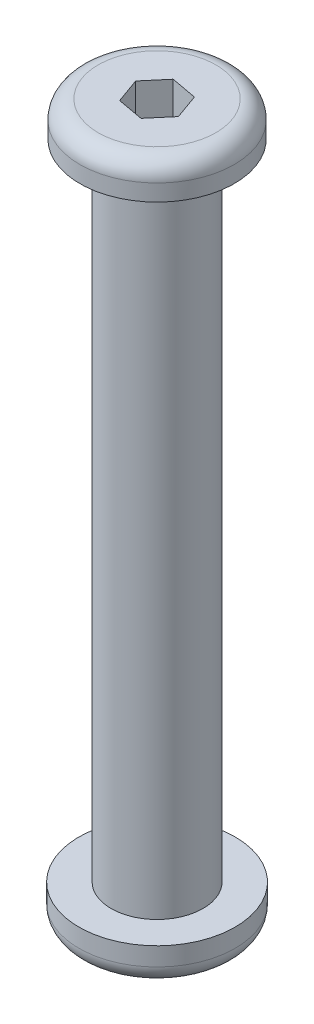
ISO-10303-21;
HEADER;
FILE_DESCRIPTION(('STEP AP214'),'2;1');
FILE_NAME('part.step','',(''),(''),'','','');
FILE_SCHEMA(('AUTOMOTIVE_DESIGN { 1 0 10303 214 1 1 1 1 }'));
ENDSEC;
DATA;
#1=APPLICATION_CONTEXT('core data for automotive mechanical design processes');
#2=APPLICATION_PROTOCOL_DEFINITION('international standard','automotive_design',2000,#1);
#3=PRODUCT_CONTEXT('',#1,'mechanical');
#4=PRODUCT('Part','Part','',(#3));
#5=PRODUCT_RELATED_PRODUCT_CATEGORY('part','',(#4));
#6=PRODUCT_DEFINITION_FORMATION('','',#4);
#7=PRODUCT_DEFINITION_CONTEXT('part definition',#1,'design');
#8=PRODUCT_DEFINITION('design','',#6,#7);
#9=PRODUCT_DEFINITION_SHAPE('','',#8);
#10=(LENGTH_UNIT() NAMED_UNIT(*) SI_UNIT(.MILLI.,.METRE.));
#11=(NAMED_UNIT(*) PLANE_ANGLE_UNIT() SI_UNIT($,.RADIAN.));
#12=(NAMED_UNIT(*) SI_UNIT($,.STERADIAN.) SOLID_ANGLE_UNIT());
#13=UNCERTAINTY_MEASURE_WITH_UNIT(LENGTH_MEASURE(1.E-05),#10,'distance_accuracy_value','');
#14=(GEOMETRIC_REPRESENTATION_CONTEXT(3) GLOBAL_UNCERTAINTY_ASSIGNED_CONTEXT((#13)) GLOBAL_UNIT_ASSIGNED_CONTEXT((#10,
#11,#12)) REPRESENTATION_CONTEXT('',''));
#15=CARTESIAN_POINT('',(0.,0.,0.));
#16=DIRECTION('',(0.,0.,1.));
#17=DIRECTION('',(1.,0.,0.));
#18=AXIS2_PLACEMENT_3D('',#15,#16,#17);
#19=CARTESIAN_POINT('',(0.,35.,0.));
#20=DIRECTION('',(0.,-1.,0.));
#21=DIRECTION('',(0.,0.,-1.));
#22=AXIS2_PLACEMENT_3D('',#19,#20,#21);
#23=CYLINDRICAL_SURFACE('',#22,2.5);
#24=CARTESIAN_POINT('',(0.,35.,0.));
#25=DIRECTION('',(0.,1.,0.));
#26=DIRECTION('',(0.,0.,1.));
#27=AXIS2_PLACEMENT_3D('',#24,#25,#26);
#28=CIRCLE('',#27,2.5);
#29=CARTESIAN_POINT('',(0.,35.,2.5));
#30=VERTEX_POINT('',#29);
#31=EDGE_CURVE('E278',#30,#30,#28,.T.);
#32=ORIENTED_EDGE('',*,*,#31,.F.);
#33=EDGE_LOOP('',(#32));
#34=FACE_BOUND('',#33,.T.);
#35=CARTESIAN_POINT('',(0.,0.,0.));
#36=DIRECTION('',(0.,-1.,0.));
#37=DIRECTION('',(0.,0.,-1.));
#38=AXIS2_PLACEMENT_3D('',#35,#36,#37);
#39=CIRCLE('',#38,2.5);
#40=CARTESIAN_POINT('',(0.,0.,-2.5));
#41=VERTEX_POINT('',#40);
#42=EDGE_CURVE('E210',#41,#41,#39,.T.);
#43=ORIENTED_EDGE('',*,*,#42,.F.);
#44=EDGE_LOOP('',(#43));
#45=FACE_BOUND('',#44,.T.);
#46=ADVANCED_FACE('F43',(#34,#45),#23,.T.);
#47=CARTESIAN_POINT('',(0.,36.9,0.));
#48=DIRECTION('',(0.,1.,0.));
#49=DIRECTION('',(0.,0.,1.));
#50=AXIS2_PLACEMENT_3D('',#47,#48,#49);
#51=PLANE('',#50);
#52=CARTESIAN_POINT('',(0.,36.9,0.));
#53=DIRECTION('',(0.,1.,0.));
#54=DIRECTION('',(0.,0.,1.));
#55=AXIS2_PLACEMENT_3D('',#52,#53,#54);
#56=CIRCLE('',#55,3.2);
#57=CARTESIAN_POINT('',(0.,36.9,3.2));
#58=VERTEX_POINT('',#57);
#59=EDGE_CURVE('E282',#58,#58,#56,.T.);
#60=ORIENTED_EDGE('',*,*,#59,.T.);
#61=EDGE_LOOP('',(#60));
#62=FACE_BOUND('',#61,.T.);
#63=DIRECTION('',(-0.983890145469255,0.,-0.178774107880554));
#64=VECTOR('',#63,1.);
#65=CARTESIAN_POINT('',(0.933529185275309,36.9,-1.10084358270035));
#66=LINE('',#65,#64);
#67=CARTESIAN_POINT('',(0.933529185275309,36.9,-1.10084358270035));
#68=VERTEX_POINT('',#67);
#69=CARTESIAN_POINT('',(-0.486593915573927,36.9,-1.35888178097279));
#70=VERTEX_POINT('',#69);
#71=EDGE_CURVE('E217',#68,#70,#66,.T.);
#72=ORIENTED_EDGE('',*,*,#71,.F.);
#73=DIRECTION('',(-0.337122153771169,0.,-0.941460914449818));
#74=VECTOR('',#73,1.);
#75=CARTESIAN_POINT('',(1.42012310084924,36.9,0.258038198272432));
#76=LINE('',#75,#74);
#77=CARTESIAN_POINT('',(1.42012310084924,36.9,0.258038198272432));
#78=VERTEX_POINT('',#77);
#79=EDGE_CURVE('E214',#78,#68,#76,.T.);
#80=ORIENTED_EDGE('',*,*,#79,.F.);
#81=DIRECTION('',(0.646767991698087,0.,-0.762686806569265));
#82=VECTOR('',#81,1.);
#83=CARTESIAN_POINT('',(0.486593915573928,36.9,1.35888178097278));
#84=LINE('',#83,#82);
#85=CARTESIAN_POINT('',(0.486593915573928,36.9,1.35888178097278));
#86=VERTEX_POINT('',#85);
#87=EDGE_CURVE('E231',#86,#78,#84,.T.);
#88=ORIENTED_EDGE('',*,*,#87,.F.);
#89=DIRECTION('',(0.983890145469255,0.,0.178774107880553));
#90=VECTOR('',#89,1.);
#91=CARTESIAN_POINT('',(-0.933529185275311,36.9,1.10084358270035));
#92=LINE('',#91,#90);
#93=CARTESIAN_POINT('',(-0.933529185275311,36.9,1.10084358270035));
#94=VERTEX_POINT('',#93);
#95=EDGE_CURVE('E227',#94,#86,#92,.T.);
#96=ORIENTED_EDGE('',*,*,#95,.F.);
#97=DIRECTION('',(0.337122153771169,0.,0.941460914449818));
#98=VECTOR('',#97,1.);
#99=CARTESIAN_POINT('',(-1.42012310084924,36.9,-0.258038198272431));
#100=LINE('',#99,#98);
#101=CARTESIAN_POINT('',(-1.42012310084924,36.9,-0.258038198272431));
#102=VERTEX_POINT('',#101);
#103=EDGE_CURVE('E224',#102,#94,#100,.T.);
#104=ORIENTED_EDGE('',*,*,#103,.F.);
#105=DIRECTION('',(-0.646767991698087,0.,0.762686806569266));
#106=VECTOR('',#105,1.);
#107=CARTESIAN_POINT('',(-0.486593915573927,36.9,-1.35888178097279));
#108=LINE('',#107,#106);
#109=EDGE_CURVE('E221',#70,#102,#108,.T.);
#110=ORIENTED_EDGE('',*,*,#109,.F.);
#111=EDGE_LOOP('',(#72,#80,#88,#96,#104,#110));
#112=FACE_BOUND('',#111,.T.);
#113=ADVANCED_FACE('F304',(#62,#112),#51,.T.);
#114=CARTESIAN_POINT('',(0.,35.,0.));
#115=DIRECTION('',(0.,1.,0.));
#116=DIRECTION('',(0.,0.,1.));
#117=AXIS2_PLACEMENT_3D('',#114,#115,#116);
#118=PLANE('',#117);
#119=ORIENTED_EDGE('',*,*,#31,.T.);
#120=EDGE_LOOP('',(#119));
#121=FACE_BOUND('',#120,.T.);
#122=CARTESIAN_POINT('',(0.,35.,0.));
#123=DIRECTION('',(0.,1.,0.));
#124=DIRECTION('',(0.,0.,1.));
#125=AXIS2_PLACEMENT_3D('',#122,#123,#124);
#126=CIRCLE('',#125,4.2);
#127=CARTESIAN_POINT('',(0.,35.,-4.2));
#128=VERTEX_POINT('',#127);
#129=EDGE_CURVE('E274',#128,#128,#126,.T.);
#130=ORIENTED_EDGE('',*,*,#129,.F.);
#131=EDGE_LOOP('',(#130));
#132=FACE_BOUND('',#131,.T.);
#133=ADVANCED_FACE('F310',(#121,#132),#118,.F.);
#134=CARTESIAN_POINT('',(0.,36.9,0.));
#135=DIRECTION('',(0.,-1.,0.));
#136=DIRECTION('',(0.,0.,-1.));
#137=AXIS2_PLACEMENT_3D('',#134,#135,#136);
#138=CYLINDRICAL_SURFACE('',#137,4.2);
#139=CARTESIAN_POINT('',(0.,35.9,0.));
#140=DIRECTION('',(0.,1.,0.));
#141=DIRECTION('',(0.,0.,1.));
#142=AXIS2_PLACEMENT_3D('',#139,#140,#141);
#143=CIRCLE('',#142,4.2);
#144=CARTESIAN_POINT('',(0.,35.9,-4.2));
#145=VERTEX_POINT('',#144);
#146=EDGE_CURVE('E286',#145,#145,#143,.F.);
#147=CARTESIAN_POINT('',(0.,35.9,-4.2));
#148=CARTESIAN_POINT('',(0.,35.890625,-4.2));
#149=CARTESIAN_POINT('',(0.,35.88125,-4.2));
#150=CARTESIAN_POINT('',(0.,35.8625,-4.2));
#151=CARTESIAN_POINT('',(0.,35.853125,-4.2));
#152=CARTESIAN_POINT('',(0.,35.834375,-4.2));
#153=CARTESIAN_POINT('',(0.,35.825,-4.2));
#154=CARTESIAN_POINT('',(0.,35.80625,-4.2));
#155=CARTESIAN_POINT('',(0.,35.796875,-4.2));
#156=CARTESIAN_POINT('',(0.,35.778125,-4.2));
#157=CARTESIAN_POINT('',(0.,35.76875,-4.2));
#158=CARTESIAN_POINT('',(0.,35.75,-4.2));
#159=CARTESIAN_POINT('',(0.,35.740625,-4.2));
#160=CARTESIAN_POINT('',(0.,35.721875,-4.2));
#161=CARTESIAN_POINT('',(0.,35.7125,-4.2));
#162=CARTESIAN_POINT('',(0.,35.69375,-4.2));
#163=CARTESIAN_POINT('',(0.,35.684375,-4.2));
#164=CARTESIAN_POINT('',(0.,35.665625,-4.2));
#165=CARTESIAN_POINT('',(0.,35.65625,-4.2));
#166=CARTESIAN_POINT('',(0.,35.6375,-4.2));
#167=CARTESIAN_POINT('',(0.,35.628125,-4.2));
#168=CARTESIAN_POINT('',(0.,35.609375,-4.2));
#169=CARTESIAN_POINT('',(0.,35.6,-4.2));
#170=CARTESIAN_POINT('',(0.,35.58125,-4.2));
#171=CARTESIAN_POINT('',(0.,35.571875,-4.2));
#172=CARTESIAN_POINT('',(0.,35.553125,-4.2));
#173=CARTESIAN_POINT('',(0.,35.54375,-4.2));
#174=CARTESIAN_POINT('',(0.,35.525,-4.2));
#175=CARTESIAN_POINT('',(0.,35.515625,-4.2));
#176=CARTESIAN_POINT('',(0.,35.496875,-4.2));
#177=CARTESIAN_POINT('',(0.,35.4875,-4.2));
#178=CARTESIAN_POINT('',(0.,35.46875,-4.2));
#179=CARTESIAN_POINT('',(0.,35.459375,-4.2));
#180=CARTESIAN_POINT('',(0.,35.440625,-4.2));
#181=CARTESIAN_POINT('',(0.,35.43125,-4.2));
#182=CARTESIAN_POINT('',(0.,35.4125,-4.2));
#183=CARTESIAN_POINT('',(0.,35.403125,-4.2));
#184=CARTESIAN_POINT('',(0.,35.384375,-4.2));
#185=CARTESIAN_POINT('',(0.,35.375,-4.2));
#186=CARTESIAN_POINT('',(0.,35.35625,-4.2));
#187=CARTESIAN_POINT('',(0.,35.346875,-4.2));
#188=CARTESIAN_POINT('',(0.,35.328125,-4.2));
#189=CARTESIAN_POINT('',(0.,35.31875,-4.2));
#190=CARTESIAN_POINT('',(0.,35.3,-4.2));
#191=CARTESIAN_POINT('',(0.,35.290625,-4.2));
#192=CARTESIAN_POINT('',(0.,35.271875,-4.2));
#193=CARTESIAN_POINT('',(0.,35.2625,-4.2));
#194=CARTESIAN_POINT('',(0.,35.24375,-4.2));
#195=CARTESIAN_POINT('',(0.,35.234375,-4.2));
#196=CARTESIAN_POINT('',(0.,35.215625,-4.2));
#197=CARTESIAN_POINT('',(0.,35.20625,-4.2));
#198=CARTESIAN_POINT('',(0.,35.1875,-4.2));
#199=CARTESIAN_POINT('',(0.,35.178125,-4.2));
#200=CARTESIAN_POINT('',(0.,35.159375,-4.2));
#201=CARTESIAN_POINT('',(0.,35.15,-4.2));
#202=CARTESIAN_POINT('',(0.,35.13125,-4.2));
#203=CARTESIAN_POINT('',(0.,35.121875,-4.2));
#204=CARTESIAN_POINT('',(0.,35.103125,-4.2));
#205=CARTESIAN_POINT('',(0.,35.09375,-4.2));
#206=CARTESIAN_POINT('',(0.,35.075,-4.2));
#207=CARTESIAN_POINT('',(0.,35.065625,-4.2));
#208=CARTESIAN_POINT('',(0.,35.046875,-4.2));
#209=CARTESIAN_POINT('',(0.,35.0375,-4.2));
#210=CARTESIAN_POINT('',(0.,35.01875,-4.2));
#211=CARTESIAN_POINT('',(0.,35.009375,-4.2));
#212=CARTESIAN_POINT('',(0.,35.,-4.2));
#213=B_SPLINE_CURVE_WITH_KNOTS('',3,(#147,#148,#149,#150,#151,#152,#153,#154,#155,#156,#157,
#158,#159,#160,#161,#162,#163,#164,#165,#166,#167,#168,#169,#170,#171,#172,#173,#174,#175,#176,
#177,#178,#179,#180,#181,#182,#183,#184,#185,#186,#187,#188,#189,#190,#191,#192,#193,#194,#195,
#196,#197,#198,#199,#200,#201,#202,#203,#204,#205,#206,#207,#208,#209,#210,#211,#212),
.UNSPECIFIED.,.F.,.F.,(4,2,2,2,2,2,2,2,2,2,2,2,2,2,2,2,2,2,2,2,2,2,2,2,2,2,2,2,2,2,2,2,4),(0.,
0.0281249999999969,0.0562499999999938,0.0843749999999976,0.112499999999995,0.140624999999998,
0.168749999999995,0.196874999999999,0.224999999999996,0.253124999999993,0.281249999999997,
0.309374999999994,0.337499999999998,0.365624999999994,0.393749999999998,0.421874999999995,
0.449999999999999,0.478124999999996,0.506249999999993,0.534374999999997,0.562499999999994,
0.590624999999997,0.618749999999994,0.646874999999998,0.674999999999995,0.703124999999992,
0.731249999999996,0.759374999999993,0.787499999999997,0.815624999999993,0.843749999999997,
0.871874999999994,0.899999999999998),.UNSPECIFIED.);
#214=EDGE_CURVE('BSEAM324',#145,#128,#213,.T.);
#215=ORIENTED_EDGE('',*,*,#146,.T.);
#216=ORIENTED_EDGE('',*,*,#129,.T.);
#217=ORIENTED_EDGE('',*,*,#214,.T.);
#218=ORIENTED_EDGE('',*,*,#214,.F.);
#219=EDGE_LOOP('',(#215,#217,#216,#218));
#220=FACE_BOUND('',#219,.T.);
#221=ADVANCED_FACE('F324',(#220),#138,.T.);
#222=CARTESIAN_POINT('',(1.42012310084924,36.9,0.258038198272432));
#223=DIRECTION('',(-0.941460914449818,0.,0.337122153771169));
#224=DIRECTION('',(0.337122153771169,0.,0.941460914449819));
#225=AXIS2_PLACEMENT_3D('',#222,#223,#224);
#226=PLANE('',#225);
#227=DIRECTION('',(-0.337122153771169,0.,-0.941460914449818));
#228=VECTOR('',#227,1.);
#229=CARTESIAN_POINT('',(1.42012310084924,35.,0.258038198272432));
#230=LINE('',#229,#228);
#231=CARTESIAN_POINT('',(1.42012310084924,35.,0.258038198272432));
#232=VERTEX_POINT('',#231);
#233=CARTESIAN_POINT('',(0.933529185275309,35.,-1.10084358270035));
#234=VERTEX_POINT('',#233);
#235=EDGE_CURVE('E67',#232,#234,#230,.T.);
#236=ORIENTED_EDGE('',*,*,#235,.F.);
#237=DIRECTION('',(0.,-1.,0.));
#238=VECTOR('',#237,1.);
#239=CARTESIAN_POINT('',(1.42012310084924,36.9,0.258038198272432));
#240=LINE('',#239,#238);
#241=EDGE_CURVE('E234',#78,#232,#240,.T.);
#242=ORIENTED_EDGE('',*,*,#241,.F.);
#243=ORIENTED_EDGE('',*,*,#79,.T.);
#244=DIRECTION('',(0.,-1.,0.));
#245=VECTOR('',#244,1.);
#246=CARTESIAN_POINT('',(0.933529185275309,36.9,-1.10084358270035));
#247=LINE('',#246,#245);
#248=EDGE_CURVE('E270',#68,#234,#247,.T.);
#249=ORIENTED_EDGE('',*,*,#248,.T.);
#250=EDGE_LOOP('',(#236,#242,#243,#249));
#251=FACE_BOUND('',#250,.T.);
#252=ADVANCED_FACE('F327',(#251),#226,.T.);
#253=CARTESIAN_POINT('',(0.933529185275309,36.9,-1.10084358270035));
#254=DIRECTION('',(-0.178774107880554,0.,0.983890145469255));
#255=DIRECTION('',(0.983890145469255,0.,0.178774107880554));
#256=AXIS2_PLACEMENT_3D('',#253,#254,#255);
#257=PLANE('',#256);
#258=DIRECTION('',(-0.983890145469255,0.,-0.178774107880554));
#259=VECTOR('',#258,1.);
#260=CARTESIAN_POINT('',(0.933529185275309,35.,-1.10084358270035));
#261=LINE('',#260,#259);
#262=CARTESIAN_POINT('',(-0.486593915573927,35.,-1.35888178097279));
#263=VERTEX_POINT('',#262);
#264=EDGE_CURVE('E237',#234,#263,#261,.T.);
#265=ORIENTED_EDGE('',*,*,#264,.F.);
#266=ORIENTED_EDGE('',*,*,#248,.F.);
#267=ORIENTED_EDGE('',*,*,#71,.T.);
#268=DIRECTION('',(0.,-1.,0.));
#269=VECTOR('',#268,1.);
#270=CARTESIAN_POINT('',(-0.486593915573927,36.9,-1.35888178097279));
#271=LINE('',#270,#269);
#272=EDGE_CURVE('E266',#70,#263,#271,.T.);
#273=ORIENTED_EDGE('',*,*,#272,.T.);
#274=EDGE_LOOP('',(#265,#266,#267,#273));
#275=FACE_BOUND('',#274,.T.);
#276=ADVANCED_FACE('F334',(#275),#257,.T.);
#277=CARTESIAN_POINT('',(-0.486593915573927,36.9,-1.35888178097279));
#278=DIRECTION('',(0.762686806569265,0.,0.646767991698086));
#279=DIRECTION('',(0.646767991698086,0.,-0.762686806569266));
#280=AXIS2_PLACEMENT_3D('',#277,#278,#279);
#281=PLANE('',#280);
#282=DIRECTION('',(-0.646767991698087,0.,0.762686806569266));
#283=VECTOR('',#282,1.);
#284=CARTESIAN_POINT('',(-0.486593915573927,35.,-1.35888178097279));
#285=LINE('',#284,#283);
#286=CARTESIAN_POINT('',(-1.42012310084924,35.,-0.258038198272431));
#287=VERTEX_POINT('',#286);
#288=EDGE_CURVE('E240',#263,#287,#285,.T.);
#289=ORIENTED_EDGE('',*,*,#288,.F.);
#290=ORIENTED_EDGE('',*,*,#272,.F.);
#291=ORIENTED_EDGE('',*,*,#109,.T.);
#292=DIRECTION('',(0.,-1.,0.));
#293=VECTOR('',#292,1.);
#294=CARTESIAN_POINT('',(-1.42012310084924,36.9,-0.258038198272431));
#295=LINE('',#294,#293);
#296=EDGE_CURVE('E262',#102,#287,#295,.T.);
#297=ORIENTED_EDGE('',*,*,#296,.T.);
#298=EDGE_LOOP('',(#289,#290,#291,#297));
#299=FACE_BOUND('',#298,.T.);
#300=ADVANCED_FACE('F338',(#299),#281,.T.);
#301=CARTESIAN_POINT('',(-1.42012310084924,36.9,-0.258038198272431));
#302=DIRECTION('',(0.941460914449818,0.,-0.337122153771169));
#303=DIRECTION('',(-0.337122153771169,0.,-0.941460914449818));
#304=AXIS2_PLACEMENT_3D('',#301,#302,#303);
#305=PLANE('',#304);
#306=DIRECTION('',(0.337122153771169,0.,0.941460914449818));
#307=VECTOR('',#306,1.);
#308=CARTESIAN_POINT('',(-1.42012310084924,35.,-0.258038198272431));
#309=LINE('',#308,#307);
#310=CARTESIAN_POINT('',(-0.933529185275311,35.,1.10084358270035));
#311=VERTEX_POINT('',#310);
#312=EDGE_CURVE('E243',#287,#311,#309,.T.);
#313=ORIENTED_EDGE('',*,*,#312,.F.);
#314=ORIENTED_EDGE('',*,*,#296,.F.);
#315=ORIENTED_EDGE('',*,*,#103,.T.);
#316=DIRECTION('',(0.,-1.,0.));
#317=VECTOR('',#316,1.);
#318=CARTESIAN_POINT('',(-0.933529185275311,36.9,1.10084358270035));
#319=LINE('',#318,#317);
#320=EDGE_CURVE('E258',#94,#311,#319,.T.);
#321=ORIENTED_EDGE('',*,*,#320,.T.);
#322=EDGE_LOOP('',(#313,#314,#315,#321));
#323=FACE_BOUND('',#322,.T.);
#324=ADVANCED_FACE('F342',(#323),#305,.T.);
#325=CARTESIAN_POINT('',(-0.933529185275311,36.9,1.10084358270035));
#326=DIRECTION('',(0.178774107880553,0.,-0.983890145469255));
#327=DIRECTION('',(-0.983890145469255,0.,-0.178774107880553));
#328=AXIS2_PLACEMENT_3D('',#325,#326,#327);
#329=PLANE('',#328);
#330=DIRECTION('',(0.983890145469255,0.,0.178774107880553));
#331=VECTOR('',#330,1.);
#332=CARTESIAN_POINT('',(-0.933529185275311,35.,1.10084358270035));
#333=LINE('',#332,#331);
#334=CARTESIAN_POINT('',(0.486593915573928,35.,1.35888178097278));
#335=VERTEX_POINT('',#334);
#336=EDGE_CURVE('E246',#311,#335,#333,.T.);
#337=ORIENTED_EDGE('',*,*,#336,.F.);
#338=ORIENTED_EDGE('',*,*,#320,.F.);
#339=ORIENTED_EDGE('',*,*,#95,.T.);
#340=DIRECTION('',(0.,-1.,0.));
#341=VECTOR('',#340,1.);
#342=CARTESIAN_POINT('',(0.486593915573928,36.9,1.35888178097278));
#343=LINE('',#342,#341);
#344=EDGE_CURVE('E254',#86,#335,#343,.T.);
#345=ORIENTED_EDGE('',*,*,#344,.T.);
#346=EDGE_LOOP('',(#337,#338,#339,#345));
#347=FACE_BOUND('',#346,.T.);
#348=ADVANCED_FACE('F346',(#347),#329,.T.);
#349=CARTESIAN_POINT('',(0.486593915573928,36.9,1.35888178097278));
#350=DIRECTION('',(-0.762686806569265,0.,-0.646767991698086));
#351=DIRECTION('',(-0.646767991698087,0.,0.762686806569265));
#352=AXIS2_PLACEMENT_3D('',#349,#350,#351);
#353=PLANE('',#352);
#354=DIRECTION('',(0.646767991698087,0.,-0.762686806569265));
#355=VECTOR('',#354,1.);
#356=CARTESIAN_POINT('',(0.486593915573928,35.,1.35888178097278));
#357=LINE('',#356,#355);
#358=EDGE_CURVE('E218',#335,#232,#357,.T.);
#359=ORIENTED_EDGE('',*,*,#358,.F.);
#360=ORIENTED_EDGE('',*,*,#344,.F.);
#361=ORIENTED_EDGE('',*,*,#87,.T.);
#362=ORIENTED_EDGE('',*,*,#241,.T.);
#363=EDGE_LOOP('',(#359,#360,#361,#362));
#364=FACE_BOUND('',#363,.T.);
#365=ADVANCED_FACE('F323',(#364),#353,.T.);
#366=CARTESIAN_POINT('',(0.,35.,0.));
#367=DIRECTION('',(0.,1.,0.));
#368=DIRECTION('',(0.,0.,1.));
#369=AXIS2_PLACEMENT_3D('',#366,#367,#368);
#370=PLANE('',#369);
#371=ORIENTED_EDGE('',*,*,#235,.T.);
#372=ORIENTED_EDGE('',*,*,#264,.T.);
#373=ORIENTED_EDGE('',*,*,#288,.T.);
#374=ORIENTED_EDGE('',*,*,#312,.T.);
#375=ORIENTED_EDGE('',*,*,#336,.T.);
#376=ORIENTED_EDGE('',*,*,#358,.T.);
#377=EDGE_LOOP('',(#371,#372,#373,#374,#375,#376));
#378=FACE_BOUND('',#377,.T.);
#379=ADVANCED_FACE('F320',(#378),#370,.T.);
#380=CARTESIAN_POINT('',(0.,-2.,0.));
#381=DIRECTION('',(0.,-1.,0.));
#382=DIRECTION('',(0.,0.,-1.));
#383=AXIS2_PLACEMENT_3D('',#380,#381,#382);
#384=PLANE('',#383);
#385=CARTESIAN_POINT('',(0.,-2.,0.));
#386=DIRECTION('',(0.,-1.,0.));
#387=DIRECTION('',(0.,0.,-1.));
#388=AXIS2_PLACEMENT_3D('',#385,#386,#387);
#389=CIRCLE('',#388,3.25);
#390=CARTESIAN_POINT('',(0.,-2.,-3.25));
#391=VERTEX_POINT('',#390);
#392=EDGE_CURVE('E52',#391,#391,#389,.T.);
#393=ORIENTED_EDGE('',*,*,#392,.T.);
#394=EDGE_LOOP('',(#393));
#395=FACE_BOUND('',#394,.T.);
#396=DIRECTION('',(-0.995901214221312,0.,0.0904476175060285));
#397=VECTOR('',#396,1.);
#398=CARTESIAN_POINT('',(0.831789314528723,-2.,1.17960157238331));
#399=LINE('',#398,#397);
#400=CARTESIAN_POINT('',(0.831789314528723,-2.,1.17960157238331));
#401=VERTEX_POINT('',#400);
#402=CARTESIAN_POINT('',(-0.605670270763652,-2.,1.31015146316997));
#403=VERTEX_POINT('',#402);
#404=EDGE_CURVE('E143',#401,#403,#399,.T.);
#405=ORIENTED_EDGE('',*,*,#404,.F.);
#406=DIRECTION('',(-0.419620672638657,0.,0.907699559928439));
#407=VECTOR('',#406,1.);
#408=CARTESIAN_POINT('',(1.43745958529237,-2.,-0.130549890786665));
#409=LINE('',#408,#407);
#410=CARTESIAN_POINT('',(1.43745958529237,-2.,-0.130549890786665));
#411=VERTEX_POINT('',#410);
#412=EDGE_CURVE('E134',#411,#401,#409,.T.);
#413=ORIENTED_EDGE('',*,*,#412,.F.);
#414=DIRECTION('',(0.576280541582655,0.,0.81725194242241));
#415=VECTOR('',#414,1.);
#416=CARTESIAN_POINT('',(0.605670270763651,-2.,-1.31015146316997));
#417=LINE('',#416,#415);
#418=CARTESIAN_POINT('',(0.605670270763652,-2.,-1.31015146316997));
#419=VERTEX_POINT('',#418);
#420=EDGE_CURVE('E171',#419,#411,#417,.T.);
#421=ORIENTED_EDGE('',*,*,#420,.F.);
#422=DIRECTION('',(0.995901214221312,0.,-0.090447617506028));
#423=VECTOR('',#422,1.);
#424=CARTESIAN_POINT('',(-0.831789314528721,-2.,-1.17960157238331));
#425=LINE('',#424,#423);
#426=CARTESIAN_POINT('',(-0.831789314528721,-2.,-1.17960157238331));
#427=VERTEX_POINT('',#426);
#428=EDGE_CURVE('E167',#427,#419,#425,.T.);
#429=ORIENTED_EDGE('',*,*,#428,.F.);
#430=DIRECTION('',(0.419620672638657,0.,-0.907699559928439));
#431=VECTOR('',#430,1.);
#432=CARTESIAN_POINT('',(-1.43745958529237,-2.,0.130549890786665));
#433=LINE('',#432,#431);
#434=CARTESIAN_POINT('',(-1.43745958529237,-2.,0.130549890786665));
#435=VERTEX_POINT('',#434);
#436=EDGE_CURVE('E162',#435,#427,#433,.T.);
#437=ORIENTED_EDGE('',*,*,#436,.F.);
#438=DIRECTION('',(-0.576280541582654,0.,-0.81725194242241));
#439=VECTOR('',#438,1.);
#440=CARTESIAN_POINT('',(-0.605670270763652,-2.,1.31015146316997));
#441=LINE('',#440,#439);
#442=EDGE_CURVE('E158',#403,#435,#441,.T.);
#443=ORIENTED_EDGE('',*,*,#442,.F.);
#444=EDGE_LOOP('',(#405,#413,#421,#429,#437,#443));
#445=FACE_BOUND('',#444,.T.);
#446=ADVANCED_FACE('F156',(#395,#445),#384,.T.);
#447=CARTESIAN_POINT('',(0.,0.,0.));
#448=DIRECTION('',(0.,-1.,0.));
#449=DIRECTION('',(0.,0.,-1.));
#450=AXIS2_PLACEMENT_3D('',#447,#448,#449);
#451=PLANE('',#450);
#452=ORIENTED_EDGE('',*,*,#42,.T.);
#453=EDGE_LOOP('',(#452));
#454=FACE_BOUND('',#453,.T.);
#455=CARTESIAN_POINT('',(0.,0.,0.));
#456=DIRECTION('',(0.,-1.,0.));
#457=DIRECTION('',(0.,0.,-1.));
#458=AXIS2_PLACEMENT_3D('',#455,#456,#457);
#459=CIRCLE('',#458,4.25);
#460=CARTESIAN_POINT('',(0.,0.,-4.25));
#461=VERTEX_POINT('',#460);
#462=EDGE_CURVE('E152',#461,#461,#459,.T.);
#463=ORIENTED_EDGE('',*,*,#462,.F.);
#464=EDGE_LOOP('',(#463));
#465=FACE_BOUND('',#464,.T.);
#466=ADVANCED_FACE('F357',(#454,#465),#451,.F.);
#467=CARTESIAN_POINT('',(0.,-2.,0.));
#468=DIRECTION('',(0.,1.,0.));
#469=DIRECTION('',(0.,0.,1.));
#470=AXIS2_PLACEMENT_3D('',#467,#468,#469);
#471=CYLINDRICAL_SURFACE('',#470,4.25);
#472=CARTESIAN_POINT('',(0.,-1.,0.));
#473=DIRECTION('',(0.,-1.,0.));
#474=DIRECTION('',(0.,0.,-1.));
#475=AXIS2_PLACEMENT_3D('',#472,#473,#474);
#476=CIRCLE('',#475,4.25);
#477=CARTESIAN_POINT('',(0.,-1.,-4.25));
#478=VERTEX_POINT('',#477);
#479=EDGE_CURVE('E11',#478,#478,#476,.F.);
#480=ORIENTED_EDGE('',*,*,#479,.T.);
#481=EDGE_LOOP('',(#480));
#482=FACE_BOUND('',#481,.T.);
#483=ORIENTED_EDGE('',*,*,#462,.T.);
#484=EDGE_LOOP('',(#483));
#485=FACE_BOUND('',#484,.T.);
#486=ADVANCED_FACE('F354',(#482,#485),#471,.T.);
#487=CARTESIAN_POINT('',(1.43745958529237,-2.,-0.130549890786665));
#488=DIRECTION('',(-0.907699559928439,0.,-0.419620672638657));
#489=DIRECTION('',(-0.419620672638657,0.,0.907699559928439));
#490=AXIS2_PLACEMENT_3D('',#487,#488,#489);
#491=PLANE('',#490);
#492=DIRECTION('',(-0.419620672638657,0.,0.907699559928439));
#493=VECTOR('',#492,1.);
#494=CARTESIAN_POINT('',(1.43745958529237,0.,-0.130549890786665));
#495=LINE('',#494,#493);
#496=CARTESIAN_POINT('',(1.43745958529237,0.,-0.130549890786665));
#497=VERTEX_POINT('',#496);
#498=CARTESIAN_POINT('',(0.831789314528723,0.,1.17960157238331));
#499=VERTEX_POINT('',#498);
#500=EDGE_CURVE('E174',#497,#499,#495,.T.);
#501=ORIENTED_EDGE('',*,*,#500,.F.);
#502=DIRECTION('',(0.,1.,0.));
#503=VECTOR('',#502,1.);
#504=CARTESIAN_POINT('',(1.43745958529237,-2.,-0.130549890786665));
#505=LINE('',#504,#503);
#506=EDGE_CURVE('E59',#411,#497,#505,.T.);
#507=ORIENTED_EDGE('',*,*,#506,.F.);
#508=ORIENTED_EDGE('',*,*,#412,.T.);
#509=DIRECTION('',(0.,1.,0.));
#510=VECTOR('',#509,1.);
#511=CARTESIAN_POINT('',(0.831789314528723,-2.,1.17960157238331));
#512=LINE('',#511,#510);
#513=EDGE_CURVE('E137',#401,#499,#512,.T.);
#514=ORIENTED_EDGE('',*,*,#513,.T.);
#515=EDGE_LOOP('',(#501,#507,#508,#514));
#516=FACE_BOUND('',#515,.T.);
#517=ADVANCED_FACE('F136',(#516),#491,.T.);
#518=CARTESIAN_POINT('',(0.831789314528723,-2.,1.17960157238331));
#519=DIRECTION('',(-0.0904476175060285,0.,-0.995901214221312));
#520=DIRECTION('',(-0.995901214221312,0.,0.0904476175060285));
#521=AXIS2_PLACEMENT_3D('',#518,#519,#520);
#522=PLANE('',#521);
#523=DIRECTION('',(-0.995901214221312,0.,0.0904476175060285));
#524=VECTOR('',#523,1.);
#525=CARTESIAN_POINT('',(0.831789314528723,0.,1.17960157238331));
#526=LINE('',#525,#524);
#527=CARTESIAN_POINT('',(-0.605670270763652,0.,1.31015146316997));
#528=VERTEX_POINT('',#527);
#529=EDGE_CURVE('E150',#499,#528,#526,.T.);
#530=ORIENTED_EDGE('',*,*,#529,.F.);
#531=ORIENTED_EDGE('',*,*,#513,.F.);
#532=ORIENTED_EDGE('',*,*,#404,.T.);
#533=DIRECTION('',(0.,1.,0.));
#534=VECTOR('',#533,1.);
#535=CARTESIAN_POINT('',(-0.605670270763652,-2.,1.31015146316997));
#536=LINE('',#535,#534);
#537=EDGE_CURVE('E153',#403,#528,#536,.T.);
#538=ORIENTED_EDGE('',*,*,#537,.T.);
#539=EDGE_LOOP('',(#530,#531,#532,#538));
#540=FACE_BOUND('',#539,.T.);
#541=ADVANCED_FACE('F147',(#540),#522,.T.);
#542=CARTESIAN_POINT('',(-0.605670270763652,-2.,1.31015146316997));
#543=DIRECTION('',(0.81725194242241,0.,-0.576280541582654));
#544=DIRECTION('',(-0.576280541582654,0.,-0.81725194242241));
#545=AXIS2_PLACEMENT_3D('',#542,#543,#544);
#546=PLANE('',#545);
#547=DIRECTION('',(-0.576280541582654,0.,-0.81725194242241));
#548=VECTOR('',#547,1.);
#549=CARTESIAN_POINT('',(-0.605670270763652,0.,1.31015146316997));
#550=LINE('',#549,#548);
#551=CARTESIAN_POINT('',(-1.43745958529237,0.,0.130549890786665));
#552=VERTEX_POINT('',#551);
#553=EDGE_CURVE('E179',#528,#552,#550,.T.);
#554=ORIENTED_EDGE('',*,*,#553,.F.);
#555=ORIENTED_EDGE('',*,*,#537,.F.);
#556=ORIENTED_EDGE('',*,*,#442,.T.);
#557=DIRECTION('',(0.,1.,0.));
#558=VECTOR('',#557,1.);
#559=CARTESIAN_POINT('',(-1.43745958529237,-2.,0.130549890786665));
#560=LINE('',#559,#558);
#561=EDGE_CURVE('E202',#435,#552,#560,.T.);
#562=ORIENTED_EDGE('',*,*,#561,.T.);
#563=EDGE_LOOP('',(#554,#555,#556,#562));
#564=FACE_BOUND('',#563,.T.);
#565=ADVANCED_FACE('F368',(#564),#546,.T.);
#566=CARTESIAN_POINT('',(-1.43745958529237,-2.,0.130549890786665));
#567=DIRECTION('',(0.907699559928438,0.,0.419620672638657));
#568=DIRECTION('',(0.419620672638657,0.,-0.907699559928439));
#569=AXIS2_PLACEMENT_3D('',#566,#567,#568);
#570=PLANE('',#569);
#571=DIRECTION('',(0.419620672638657,0.,-0.907699559928439));
#572=VECTOR('',#571,1.);
#573=CARTESIAN_POINT('',(-1.43745958529237,0.,0.130549890786665));
#574=LINE('',#573,#572);
#575=CARTESIAN_POINT('',(-0.831789314528721,0.,-1.17960157238331));
#576=VERTEX_POINT('',#575);
#577=EDGE_CURVE('E183',#552,#576,#574,.T.);
#578=ORIENTED_EDGE('',*,*,#577,.F.);
#579=ORIENTED_EDGE('',*,*,#561,.F.);
#580=ORIENTED_EDGE('',*,*,#436,.T.);
#581=DIRECTION('',(0.,1.,0.));
#582=VECTOR('',#581,1.);
#583=CARTESIAN_POINT('',(-0.831789314528721,-2.,-1.17960157238331));
#584=LINE('',#583,#582);
#585=EDGE_CURVE('E199',#427,#576,#584,.T.);
#586=ORIENTED_EDGE('',*,*,#585,.T.);
#587=EDGE_LOOP('',(#578,#579,#580,#586));
#588=FACE_BOUND('',#587,.T.);
#589=ADVANCED_FACE('F371',(#588),#570,.T.);
#590=CARTESIAN_POINT('',(-0.831789314528721,-2.,-1.17960157238331));
#591=DIRECTION('',(0.090447617506028,0.,0.995901214221312));
#592=DIRECTION('',(0.995901214221312,0.,-0.090447617506028));
#593=AXIS2_PLACEMENT_3D('',#590,#591,#592);
#594=PLANE('',#593);
#595=DIRECTION('',(0.995901214221312,0.,-0.090447617506028));
#596=VECTOR('',#595,1.);
#597=CARTESIAN_POINT('',(-0.831789314528721,0.,-1.17960157238331));
#598=LINE('',#597,#596);
#599=CARTESIAN_POINT('',(0.605670270763651,0.,-1.31015146316997));
#600=VERTEX_POINT('',#599);
#601=EDGE_CURVE('E187',#576,#600,#598,.T.);
#602=ORIENTED_EDGE('',*,*,#601,.F.);
#603=ORIENTED_EDGE('',*,*,#585,.F.);
#604=ORIENTED_EDGE('',*,*,#428,.T.);
#605=DIRECTION('',(0.,1.,0.));
#606=VECTOR('',#605,1.);
#607=CARTESIAN_POINT('',(0.605670270763651,-2.,-1.31015146316997));
#608=LINE('',#607,#606);
#609=EDGE_CURVE('E196',#419,#600,#608,.T.);
#610=ORIENTED_EDGE('',*,*,#609,.T.);
#611=EDGE_LOOP('',(#602,#603,#604,#610));
#612=FACE_BOUND('',#611,.T.);
#613=ADVANCED_FACE('F375',(#612),#594,.T.);
#614=CARTESIAN_POINT('',(0.605670270763651,-2.,-1.31015146316997));
#615=DIRECTION('',(-0.81725194242241,0.,0.576280541582655));
#616=DIRECTION('',(0.576280541582655,0.,0.81725194242241));
#617=AXIS2_PLACEMENT_3D('',#614,#615,#616);
#618=PLANE('',#617);
#619=DIRECTION('',(0.576280541582655,0.,0.81725194242241));
#620=VECTOR('',#619,1.);
#621=CARTESIAN_POINT('',(0.605670270763651,0.,-1.31015146316997));
#622=LINE('',#621,#620);
#623=EDGE_CURVE('E144',#600,#497,#622,.T.);
#624=ORIENTED_EDGE('',*,*,#623,.F.);
#625=ORIENTED_EDGE('',*,*,#609,.F.);
#626=ORIENTED_EDGE('',*,*,#420,.T.);
#627=ORIENTED_EDGE('',*,*,#506,.T.);
#628=EDGE_LOOP('',(#624,#625,#626,#627));
#629=FACE_BOUND('',#628,.T.);
#630=ADVANCED_FACE('F318',(#629),#618,.T.);
#631=CARTESIAN_POINT('',(0.,0.,0.));
#632=DIRECTION('',(0.,1.,0.));
#633=DIRECTION('',(0.,0.,1.));
#634=AXIS2_PLACEMENT_3D('',#631,#632,#633);
#635=PLANE('',#634);
#636=ORIENTED_EDGE('',*,*,#623,.T.);
#637=ORIENTED_EDGE('',*,*,#500,.T.);
#638=ORIENTED_EDGE('',*,*,#529,.T.);
#639=ORIENTED_EDGE('',*,*,#553,.T.);
#640=ORIENTED_EDGE('',*,*,#577,.T.);
#641=ORIENTED_EDGE('',*,*,#601,.T.);
#642=EDGE_LOOP('',(#636,#637,#638,#639,#640,#641));
#643=FACE_BOUND('',#642,.T.);
#644=ADVANCED_FACE('F300',(#643),#635,.F.);
#645=CARTESIAN_POINT('',(0.,35.9,0.));
#646=DIRECTION('',(0.,1.,0.));
#647=DIRECTION('',(0.,0.,1.));
#648=AXIS2_PLACEMENT_3D('',#645,#646,#647);
#649=TOROIDAL_SURFACE('',#648,3.2,1.);
#650=ORIENTED_EDGE('',*,*,#146,.F.);
#651=EDGE_LOOP('',(#650));
#652=FACE_BOUND('',#651,.T.);
#653=ORIENTED_EDGE('',*,*,#59,.F.);
#654=EDGE_LOOP('',(#653));
#655=FACE_BOUND('',#654,.T.);
#656=ADVANCED_FACE('F295',(#652,#655),#649,.T.);
#657=CARTESIAN_POINT('',(0.,-1.,0.));
#658=DIRECTION('',(0.,-1.,0.));
#659=DIRECTION('',(0.,0.,-1.));
#660=AXIS2_PLACEMENT_3D('',#657,#658,#659);
#661=TOROIDAL_SURFACE('',#660,3.25,1.);
#662=ORIENTED_EDGE('',*,*,#479,.F.);
#663=EDGE_LOOP('',(#662));
#664=FACE_BOUND('',#663,.T.);
#665=ORIENTED_EDGE('',*,*,#392,.F.);
#666=EDGE_LOOP('',(#665));
#667=FACE_BOUND('',#666,.T.);
#668=ADVANCED_FACE('F45',(#664,#667),#661,.T.);
#669=CLOSED_SHELL('',(#46,#113,#133,#221,#252,#276,#300,#324,#348,#365,#379,#446,#466,#486,#517,
#541,#565,#589,#613,#630,#644,#656,#668));
#670=MANIFOLD_SOLID_BREP('B2',#669);
#671=ADVANCED_BREP_SHAPE_REPRESENTATION('',(#18,#670),#14);
#672=SHAPE_DEFINITION_REPRESENTATION(#9,#671);
ENDSEC;
END-ISO-10303-21;
